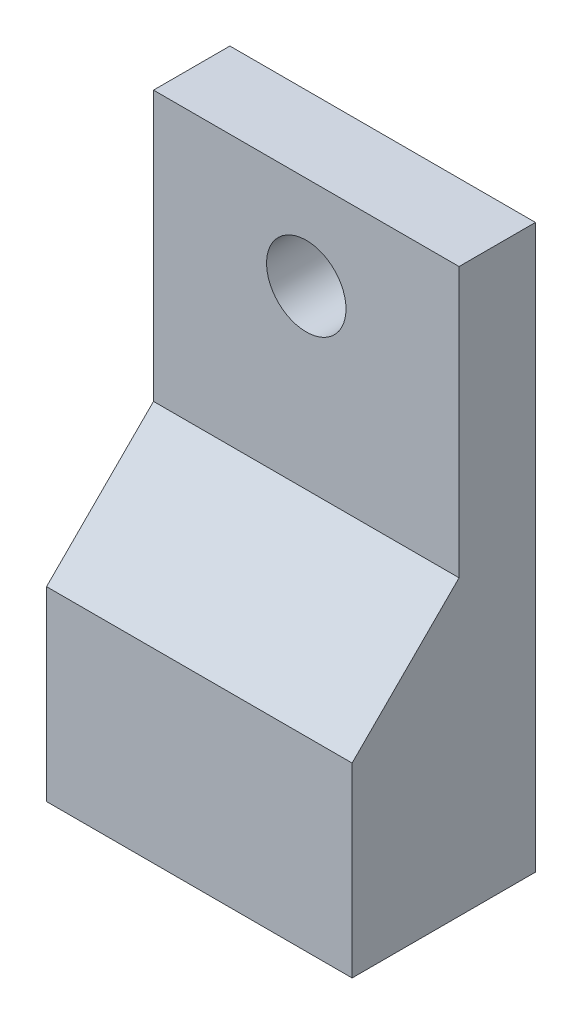
ISO-10303-21;
HEADER;
FILE_DESCRIPTION(('STEP AP214'),'2;1');
FILE_NAME('part.step','',(''),(''),'','','');
FILE_SCHEMA(('AUTOMOTIVE_DESIGN { 1 0 10303 214 1 1 1 1 }'));
ENDSEC;
DATA;
#1=APPLICATION_CONTEXT('core data for automotive mechanical design processes');
#2=APPLICATION_PROTOCOL_DEFINITION('international standard','automotive_design',2000,#1);
#3=PRODUCT_CONTEXT('',#1,'mechanical');
#4=PRODUCT('Part','Part','',(#3));
#5=PRODUCT_RELATED_PRODUCT_CATEGORY('part','',(#4));
#6=PRODUCT_DEFINITION_FORMATION('','',#4);
#7=PRODUCT_DEFINITION_CONTEXT('part definition',#1,'design');
#8=PRODUCT_DEFINITION('design','',#6,#7);
#9=PRODUCT_DEFINITION_SHAPE('','',#8);
#10=(LENGTH_UNIT() NAMED_UNIT(*) SI_UNIT(.MILLI.,.METRE.));
#11=(NAMED_UNIT(*) PLANE_ANGLE_UNIT() SI_UNIT($,.RADIAN.));
#12=(NAMED_UNIT(*) SI_UNIT($,.STERADIAN.) SOLID_ANGLE_UNIT());
#13=UNCERTAINTY_MEASURE_WITH_UNIT(LENGTH_MEASURE(1.E-05),#10,'distance_accuracy_value','');
#14=(GEOMETRIC_REPRESENTATION_CONTEXT(3) GLOBAL_UNCERTAINTY_ASSIGNED_CONTEXT((#13)) GLOBAL_UNIT_ASSIGNED_CONTEXT((#10,
#11,#12)) REPRESENTATION_CONTEXT('',''));
#15=CARTESIAN_POINT('',(0.,0.,0.));
#16=DIRECTION('',(0.,0.,1.));
#17=DIRECTION('',(1.,0.,0.));
#18=AXIS2_PLACEMENT_3D('',#15,#16,#17);
#19=CARTESIAN_POINT('',(0.,0.,5.));
#20=DIRECTION('',(0.,0.,-1.));
#21=DIRECTION('',(-1.,0.,0.));
#22=AXIS2_PLACEMENT_3D('',#19,#20,#21);
#23=PLANE('',#22);
#24=CARTESIAN_POINT('',(14.5242877975986,-284.981509322984,5.));
#25=DIRECTION('',(0.,0.,1.));
#26=DIRECTION('',(1.,0.,0.));
#27=AXIS2_PLACEMENT_3D('',#24,#25,#26);
#28=CIRCLE('',#27,2.6);
#29=CARTESIAN_POINT('',(17.1242877975986,-284.981509322984,5.));
#30=VERTEX_POINT('',#29);
#31=EDGE_CURVE('E112',#30,#30,#28,.T.);
#32=ORIENTED_EDGE('',*,*,#31,.F.);
#33=EDGE_LOOP('',(#32));
#34=FACE_BOUND('',#33,.T.);
#35=DIRECTION('',(-1.,0.,0.));
#36=VECTOR('',#35,1.);
#37=CARTESIAN_POINT('',(24.5242877975985,-296.515613294588,5.));
#38=LINE('',#37,#36);
#39=CARTESIAN_POINT('',(24.5242877975985,-296.515613294588,5.));
#40=VERTEX_POINT('',#39);
#41=CARTESIAN_POINT('',(4.52428779759864,-296.515613294588,5.));
#42=VERTEX_POINT('',#41);
#43=EDGE_CURVE('E107',#40,#42,#38,.T.);
#44=ORIENTED_EDGE('',*,*,#43,.F.);
#45=DIRECTION('',(0.,1.,0.));
#46=VECTOR('',#45,1.);
#47=CARTESIAN_POINT('',(24.5242877975985,-315.7,5.));
#48=LINE('',#47,#46);
#49=CARTESIAN_POINT('',(24.5242877975985,-278.869916911083,5.));
#50=VERTEX_POINT('',#49);
#51=EDGE_CURVE('E120',#40,#50,#48,.T.);
#52=ORIENTED_EDGE('',*,*,#51,.T.);
#53=DIRECTION('',(-1.,0.,0.));
#54=VECTOR('',#53,1.);
#55=CARTESIAN_POINT('',(4.52428779759864,-278.869916911083,5.));
#56=LINE('',#55,#54);
#57=CARTESIAN_POINT('',(4.52428779759864,-278.869916911083,5.));
#58=VERTEX_POINT('',#57);
#59=EDGE_CURVE('E123',#50,#58,#56,.T.);
#60=ORIENTED_EDGE('',*,*,#59,.T.);
#61=DIRECTION('',(0.,-1.,0.));
#62=VECTOR('',#61,1.);
#63=CARTESIAN_POINT('',(4.52428779759864,-315.7,5.));
#64=LINE('',#63,#62);
#65=EDGE_CURVE('E117',#58,#42,#64,.T.);
#66=ORIENTED_EDGE('',*,*,#65,.T.);
#67=EDGE_LOOP('',(#44,#52,#60,#66));
#68=FACE_BOUND('',#67,.T.);
#69=ADVANCED_FACE('F32',(#34,#68),#23,.F.);
#70=CARTESIAN_POINT('',(0.,0.,0.));
#71=DIRECTION('',(0.,0.,-1.));
#72=DIRECTION('',(-1.,0.,0.));
#73=AXIS2_PLACEMENT_3D('',#70,#71,#72);
#74=PLANE('',#73);
#75=DIRECTION('',(0.,-1.,0.));
#76=VECTOR('',#75,1.);
#77=CARTESIAN_POINT('',(4.52428779759864,-315.7,0.));
#78=LINE('',#77,#76);
#79=CARTESIAN_POINT('',(4.52428779759864,-278.869916911083,0.));
#80=VERTEX_POINT('',#79);
#81=CARTESIAN_POINT('',(4.52428779759864,-315.7,0.));
#82=VERTEX_POINT('',#81);
#83=EDGE_CURVE('E101',#80,#82,#78,.T.);
#84=ORIENTED_EDGE('',*,*,#83,.F.);
#85=DIRECTION('',(-1.,0.,0.));
#86=VECTOR('',#85,1.);
#87=CARTESIAN_POINT('',(4.52428779759864,-278.869916911083,0.));
#88=LINE('',#87,#86);
#89=CARTESIAN_POINT('',(24.5242877975985,-278.869916911083,0.));
#90=VERTEX_POINT('',#89);
#91=EDGE_CURVE('E121',#90,#80,#88,.T.);
#92=ORIENTED_EDGE('',*,*,#91,.F.);
#93=DIRECTION('',(0.,1.,0.));
#94=VECTOR('',#93,1.);
#95=CARTESIAN_POINT('',(24.5242877975985,-315.7,0.));
#96=LINE('',#95,#94);
#97=CARTESIAN_POINT('',(24.5242877975985,-315.7,0.));
#98=VERTEX_POINT('',#97);
#99=EDGE_CURVE('E129',#98,#90,#96,.T.);
#100=ORIENTED_EDGE('',*,*,#99,.F.);
#101=DIRECTION('',(1.,0.,0.));
#102=VECTOR('',#101,1.);
#103=CARTESIAN_POINT('',(4.52428779759864,-315.7,0.));
#104=LINE('',#103,#102);
#105=EDGE_CURVE('E127',#82,#98,#104,.T.);
#106=ORIENTED_EDGE('',*,*,#105,.F.);
#107=EDGE_LOOP('',(#84,#92,#100,#106));
#108=FACE_BOUND('',#107,.T.);
#109=CARTESIAN_POINT('',(14.5242877975986,-284.981509322984,0.));
#110=DIRECTION('',(0.,0.,1.));
#111=DIRECTION('',(1.,0.,0.));
#112=AXIS2_PLACEMENT_3D('',#109,#110,#111);
#113=CIRCLE('',#112,2.6);
#114=CARTESIAN_POINT('',(17.1242877975986,-284.981509322984,0.));
#115=VERTEX_POINT('',#114);
#116=EDGE_CURVE('E92',#115,#115,#113,.T.);
#117=ORIENTED_EDGE('',*,*,#116,.T.);
#118=EDGE_LOOP('',(#117));
#119=FACE_BOUND('',#118,.T.);
#120=ADVANCED_FACE('F148',(#108,#119),#74,.T.);
#121=CARTESIAN_POINT('',(4.52428779759864,-315.7,5.));
#122=DIRECTION('',(1.,0.,0.));
#123=DIRECTION('',(0.,0.,-1.));
#124=AXIS2_PLACEMENT_3D('',#121,#122,#123);
#125=PLANE('',#124);
#126=DIRECTION('',(0.,-1.,0.));
#127=VECTOR('',#126,1.);
#128=CARTESIAN_POINT('',(4.52428779759864,-315.7,12.));
#129=LINE('',#128,#127);
#130=CARTESIAN_POINT('',(4.52428779759864,-303.515613294588,12.));
#131=VERTEX_POINT('',#130);
#132=CARTESIAN_POINT('',(4.52428779759864,-315.7,12.));
#133=VERTEX_POINT('',#132);
#134=EDGE_CURVE('E85',#131,#133,#129,.T.);
#135=ORIENTED_EDGE('',*,*,#134,.F.);
#136=DIRECTION('',(0.,0.707106781186549,-0.707106781186546));
#137=VECTOR('',#136,1.);
#138=CARTESIAN_POINT('',(4.52428779759864,-303.515613294588,12.));
#139=LINE('',#138,#137);
#140=EDGE_CURVE('E40',#131,#42,#139,.T.);
#141=ORIENTED_EDGE('',*,*,#140,.T.);
#142=ORIENTED_EDGE('',*,*,#65,.F.);
#143=DIRECTION('',(0.,0.,-1.));
#144=VECTOR('',#143,1.);
#145=CARTESIAN_POINT('',(4.52428779759864,-278.869916911083,5.));
#146=LINE('',#145,#144);
#147=EDGE_CURVE('E125',#58,#80,#146,.T.);
#148=ORIENTED_EDGE('',*,*,#147,.T.);
#149=ORIENTED_EDGE('',*,*,#83,.T.);
#150=DIRECTION('',(0.,0.,-1.));
#151=VECTOR('',#150,1.);
#152=CARTESIAN_POINT('',(4.52428779759864,-315.7,5.));
#153=LINE('',#152,#151);
#154=EDGE_CURVE('E97',#133,#82,#153,.T.);
#155=ORIENTED_EDGE('',*,*,#154,.F.);
#156=EDGE_LOOP('',(#135,#141,#142,#148,#149,#155));
#157=FACE_BOUND('',#156,.T.);
#158=ADVANCED_FACE('F98',(#157),#125,.F.);
#159=CARTESIAN_POINT('',(4.52428779759864,-315.7,5.));
#160=DIRECTION('',(0.,1.,0.));
#161=DIRECTION('',(0.,0.,1.));
#162=AXIS2_PLACEMENT_3D('',#159,#160,#161);
#163=PLANE('',#162);
#164=ORIENTED_EDGE('',*,*,#105,.T.);
#165=DIRECTION('',(0.,0.,-1.));
#166=VECTOR('',#165,1.);
#167=CARTESIAN_POINT('',(24.5242877975985,-315.7,5.));
#168=LINE('',#167,#166);
#169=CARTESIAN_POINT('',(24.5242877975985,-315.7,12.));
#170=VERTEX_POINT('',#169);
#171=EDGE_CURVE('E103',#170,#98,#168,.T.);
#172=ORIENTED_EDGE('',*,*,#171,.F.);
#173=DIRECTION('',(1.,0.,0.));
#174=VECTOR('',#173,1.);
#175=CARTESIAN_POINT('',(24.5242877975986,-315.7,12.));
#176=LINE('',#175,#174);
#177=EDGE_CURVE('E89',#133,#170,#176,.T.);
#178=ORIENTED_EDGE('',*,*,#177,.F.);
#179=ORIENTED_EDGE('',*,*,#154,.T.);
#180=EDGE_LOOP('',(#164,#172,#178,#179));
#181=FACE_BOUND('',#180,.T.);
#182=ADVANCED_FACE('F105',(#181),#163,.F.);
#183=CARTESIAN_POINT('',(24.5242877975985,-315.7,5.));
#184=DIRECTION('',(-1.,0.,0.));
#185=DIRECTION('',(0.,0.,1.));
#186=AXIS2_PLACEMENT_3D('',#183,#184,#185);
#187=PLANE('',#186);
#188=ORIENTED_EDGE('',*,*,#51,.F.);
#189=DIRECTION('',(0.,-0.707106781186549,0.707106781186546));
#190=VECTOR('',#189,1.);
#191=CARTESIAN_POINT('',(24.5242877975986,-303.515613294588,12.));
#192=LINE('',#191,#190);
#193=CARTESIAN_POINT('',(24.5242877975985,-303.515613294588,12.));
#194=VERTEX_POINT('',#193);
#195=EDGE_CURVE('E11',#40,#194,#192,.T.);
#196=ORIENTED_EDGE('',*,*,#195,.T.);
#197=DIRECTION('',(0.,1.,0.));
#198=VECTOR('',#197,1.);
#199=CARTESIAN_POINT('',(24.5242877975985,-315.7,12.));
#200=LINE('',#199,#198);
#201=EDGE_CURVE('E93',#170,#194,#200,.T.);
#202=ORIENTED_EDGE('',*,*,#201,.F.);
#203=ORIENTED_EDGE('',*,*,#171,.T.);
#204=ORIENTED_EDGE('',*,*,#99,.T.);
#205=DIRECTION('',(0.,0.,-1.));
#206=VECTOR('',#205,1.);
#207=CARTESIAN_POINT('',(24.5242877975985,-278.869916911083,5.));
#208=LINE('',#207,#206);
#209=EDGE_CURVE('E133',#50,#90,#208,.T.);
#210=ORIENTED_EDGE('',*,*,#209,.F.);
#211=EDGE_LOOP('',(#188,#196,#202,#203,#204,#210));
#212=FACE_BOUND('',#211,.T.);
#213=ADVANCED_FACE('F162',(#212),#187,.F.);
#214=CARTESIAN_POINT('',(4.52428779759864,-278.869916911083,5.));
#215=DIRECTION('',(0.,-1.,0.));
#216=DIRECTION('',(0.,0.,-1.));
#217=AXIS2_PLACEMENT_3D('',#214,#215,#216);
#218=PLANE('',#217);
#219=ORIENTED_EDGE('',*,*,#91,.T.);
#220=ORIENTED_EDGE('',*,*,#147,.F.);
#221=ORIENTED_EDGE('',*,*,#59,.F.);
#222=ORIENTED_EDGE('',*,*,#209,.T.);
#223=EDGE_LOOP('',(#219,#220,#221,#222));
#224=FACE_BOUND('',#223,.T.);
#225=ADVANCED_FACE('F159',(#224),#218,.F.);
#226=CARTESIAN_POINT('',(14.5242877975986,-284.981509322984,5.));
#227=DIRECTION('',(0.,0.,-1.));
#228=DIRECTION('',(-1.,0.,0.));
#229=AXIS2_PLACEMENT_3D('',#226,#227,#228);
#230=CYLINDRICAL_SURFACE('',#229,2.6);
#231=ORIENTED_EDGE('',*,*,#31,.T.);
#232=EDGE_LOOP('',(#231));
#233=FACE_BOUND('',#232,.T.);
#234=ORIENTED_EDGE('',*,*,#116,.F.);
#235=EDGE_LOOP('',(#234));
#236=FACE_BOUND('',#235,.T.);
#237=ADVANCED_FACE('F145',(#233,#236),#230,.F.);
#238=CARTESIAN_POINT('',(-115.475712202401,-304.1,12.));
#239=DIRECTION('',(0.,0.,1.));
#240=DIRECTION('',(0.,1.,0.));
#241=AXIS2_PLACEMENT_3D('',#238,#239,#240);
#242=PLANE('',#241);
#243=ORIENTED_EDGE('',*,*,#201,.T.);
#244=DIRECTION('',(-1.,0.,0.));
#245=VECTOR('',#244,1.);
#246=CARTESIAN_POINT('',(4.52428779759864,-303.515613294588,12.));
#247=LINE('',#246,#245);
#248=EDGE_CURVE('E90',#194,#131,#247,.T.);
#249=ORIENTED_EDGE('',*,*,#248,.T.);
#250=ORIENTED_EDGE('',*,*,#134,.T.);
#251=ORIENTED_EDGE('',*,*,#177,.T.);
#252=EDGE_LOOP('',(#243,#249,#250,#251));
#253=FACE_BOUND('',#252,.T.);
#254=ADVANCED_FACE('F87',(#253),#242,.T.);
#255=CARTESIAN_POINT('',(-115.475712202401,-303.515613294588,12.));
#256=DIRECTION('',(0.,0.707106781186546,0.707106781186549));
#257=DIRECTION('',(1.,0.,0.));
#258=AXIS2_PLACEMENT_3D('',#255,#256,#257);
#259=PLANE('',#258);
#260=ORIENTED_EDGE('',*,*,#195,.F.);
#261=ORIENTED_EDGE('',*,*,#43,.T.);
#262=ORIENTED_EDGE('',*,*,#140,.F.);
#263=ORIENTED_EDGE('',*,*,#248,.F.);
#264=EDGE_LOOP('',(#260,#261,#262,#263));
#265=FACE_BOUND('',#264,.T.);
#266=ADVANCED_FACE('F34',(#265),#259,.T.);
#267=CLOSED_SHELL('',(#69,#120,#158,#182,#213,#225,#237,#254,#266));
#268=MANIFOLD_SOLID_BREP('B2',#267);
#269=ADVANCED_BREP_SHAPE_REPRESENTATION('',(#18,#268),#14);
#270=SHAPE_DEFINITION_REPRESENTATION(#9,#269);
ENDSEC;
END-ISO-10303-21;
